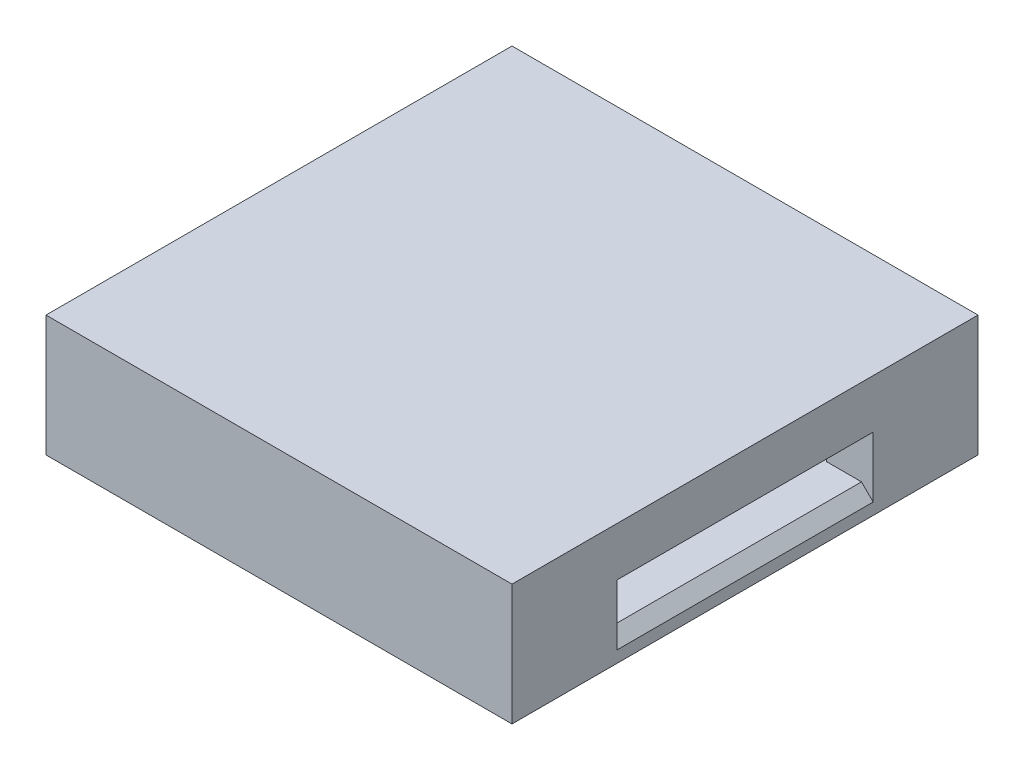
ISO-10303-21;
HEADER;
FILE_DESCRIPTION(('STEP AP214'),'2;1');
FILE_NAME('part.step','',(''),(''),'','','');
FILE_SCHEMA(('AUTOMOTIVE_DESIGN { 1 0 10303 214 1 1 1 1 }'));
ENDSEC;
DATA;
#1=APPLICATION_CONTEXT('core data for automotive mechanical design processes');
#2=APPLICATION_PROTOCOL_DEFINITION('international standard','automotive_design',2000,#1);
#3=PRODUCT_CONTEXT('',#1,'mechanical');
#4=PRODUCT('Part','Part','',(#3));
#5=PRODUCT_RELATED_PRODUCT_CATEGORY('part','',(#4));
#6=PRODUCT_DEFINITION_FORMATION('','',#4);
#7=PRODUCT_DEFINITION_CONTEXT('part definition',#1,'design');
#8=PRODUCT_DEFINITION('design','',#6,#7);
#9=PRODUCT_DEFINITION_SHAPE('','',#8);
#10=(LENGTH_UNIT() NAMED_UNIT(*) SI_UNIT(.MILLI.,.METRE.));
#11=(NAMED_UNIT(*) PLANE_ANGLE_UNIT() SI_UNIT($,.RADIAN.));
#12=(NAMED_UNIT(*) SI_UNIT($,.STERADIAN.) SOLID_ANGLE_UNIT());
#13=UNCERTAINTY_MEASURE_WITH_UNIT(LENGTH_MEASURE(1.E-05),#10,'distance_accuracy_value','');
#14=(GEOMETRIC_REPRESENTATION_CONTEXT(3) GLOBAL_UNCERTAINTY_ASSIGNED_CONTEXT((#13)) GLOBAL_UNIT_ASSIGNED_CONTEXT((#10,
#11,#12)) REPRESENTATION_CONTEXT('',''));
#15=CARTESIAN_POINT('',(0.,0.,0.));
#16=DIRECTION('',(0.,0.,1.));
#17=DIRECTION('',(1.,0.,0.));
#18=AXIS2_PLACEMENT_3D('',#15,#16,#17);
#19=CARTESIAN_POINT('',(0.,1.,0.));
#20=DIRECTION('',(0.,-1.,0.));
#21=DIRECTION('',(0.,0.,-1.));
#22=AXIS2_PLACEMENT_3D('',#19,#20,#21);
#23=PLANE('',#22);
#24=DIRECTION('',(-1.,0.,0.));
#25=VECTOR('',#24,1.);
#26=CARTESIAN_POINT('',(0.,1.,-4.5));
#27=LINE('',#26,#25);
#28=CARTESIAN_POINT('',(19.5,1.,-4.5));
#29=VERTEX_POINT('',#28);
#30=CARTESIAN_POINT('',(18.,1.,-4.5));
#31=VERTEX_POINT('',#30);
#32=EDGE_CURVE('E199',#29,#31,#27,.T.);
#33=ORIENTED_EDGE('',*,*,#32,.F.);
#34=DIRECTION('',(0.,0.,-1.));
#35=VECTOR('',#34,1.);
#36=CARTESIAN_POINT('',(19.5,1.,0.));
#37=LINE('',#36,#35);
#38=CARTESIAN_POINT('',(19.5,1.,-15.5));
#39=VERTEX_POINT('',#38);
#40=EDGE_CURVE('E150',#29,#39,#37,.T.);
#41=ORIENTED_EDGE('',*,*,#40,.T.);
#42=DIRECTION('',(-1.,0.,0.));
#43=VECTOR('',#42,1.);
#44=CARTESIAN_POINT('',(0.,1.,-15.5));
#45=LINE('',#44,#43);
#46=CARTESIAN_POINT('',(18.,1.,-15.5));
#47=VERTEX_POINT('',#46);
#48=EDGE_CURVE('E196',#39,#47,#45,.T.);
#49=ORIENTED_EDGE('',*,*,#48,.T.);
#50=DIRECTION('',(0.,0.,1.));
#51=VECTOR('',#50,1.);
#52=CARTESIAN_POINT('',(18.,1.,0.));
#53=LINE('',#52,#51);
#54=CARTESIAN_POINT('',(18.,1.,-18.05));
#55=VERTEX_POINT('',#54);
#56=EDGE_CURVE('E193',#55,#47,#53,.T.);
#57=ORIENTED_EDGE('',*,*,#56,.F.);
#58=DIRECTION('',(1.,0.,0.));
#59=VECTOR('',#58,1.);
#60=CARTESIAN_POINT('',(0.,1.,-18.05));
#61=LINE('',#60,#59);
#62=CARTESIAN_POINT('',(1.99999999999999,1.,-18.05));
#63=VERTEX_POINT('',#62);
#64=EDGE_CURVE('E171',#63,#55,#61,.T.);
#65=ORIENTED_EDGE('',*,*,#64,.F.);
#66=DIRECTION('',(0.,0.,1.));
#67=VECTOR('',#66,1.);
#68=CARTESIAN_POINT('',(2.,1.,0.));
#69=LINE('',#68,#67);
#70=CARTESIAN_POINT('',(2.,1.,-1.95));
#71=VERTEX_POINT('',#70);
#72=EDGE_CURVE('E176',#63,#71,#69,.T.);
#73=ORIENTED_EDGE('',*,*,#72,.T.);
#74=DIRECTION('',(1.,0.,0.));
#75=VECTOR('',#74,1.);
#76=CARTESIAN_POINT('',(0.,1.,-1.95));
#77=LINE('',#76,#75);
#78=CARTESIAN_POINT('',(18.,1.,-1.95));
#79=VERTEX_POINT('',#78);
#80=EDGE_CURVE('E201',#71,#79,#77,.T.);
#81=ORIENTED_EDGE('',*,*,#80,.T.);
#82=EDGE_CURVE('E197',#31,#79,#53,.T.);
#83=ORIENTED_EDGE('',*,*,#82,.F.);
#84=EDGE_LOOP('',(#33,#41,#49,#57,#65,#73,#81,#83));
#85=FACE_BOUND('',#84,.T.);
#86=ADVANCED_FACE('F43',(#85),#23,.F.);
#87=CARTESIAN_POINT('',(0.,1.,0.));
#88=DIRECTION('',(1.,0.,0.));
#89=DIRECTION('',(0.,0.,-1.));
#90=AXIS2_PLACEMENT_3D('',#87,#88,#89);
#91=PLANE('',#90);
#92=DIRECTION('',(0.,0.,1.));
#93=VECTOR('',#92,1.);
#94=CARTESIAN_POINT('',(0.,0.,0.));
#95=LINE('',#94,#93);
#96=CARTESIAN_POINT('',(0.,0.,-20.));
#97=VERTEX_POINT('',#96);
#98=CARTESIAN_POINT('',(0.,0.,0.));
#99=VERTEX_POINT('',#98);
#100=EDGE_CURVE('E148',#97,#99,#95,.T.);
#101=ORIENTED_EDGE('',*,*,#100,.T.);
#102=DIRECTION('',(0.,-1.,0.));
#103=VECTOR('',#102,1.);
#104=CARTESIAN_POINT('',(0.,1.,0.));
#105=LINE('',#104,#103);
#106=CARTESIAN_POINT('',(0.,5.2,0.));
#107=VERTEX_POINT('',#106);
#108=EDGE_CURVE('E141',#107,#99,#105,.T.);
#109=ORIENTED_EDGE('',*,*,#108,.F.);
#110=DIRECTION('',(0.,0.,1.));
#111=VECTOR('',#110,1.);
#112=CARTESIAN_POINT('',(0.,5.2,-20.));
#113=LINE('',#112,#111);
#114=CARTESIAN_POINT('',(0.,5.2,-20.));
#115=VERTEX_POINT('',#114);
#116=EDGE_CURVE('E146',#115,#107,#113,.T.);
#117=ORIENTED_EDGE('',*,*,#116,.F.);
#118=DIRECTION('',(0.,-1.,0.));
#119=VECTOR('',#118,1.);
#120=CARTESIAN_POINT('',(0.,1.,-20.));
#121=LINE('',#120,#119);
#122=EDGE_CURVE('E230',#115,#97,#121,.T.);
#123=ORIENTED_EDGE('',*,*,#122,.T.);
#124=EDGE_LOOP('',(#101,#109,#117,#123));
#125=FACE_BOUND('',#124,.T.);
#126=ADVANCED_FACE('F143',(#125),#91,.F.);
#127=CARTESIAN_POINT('',(0.,1.,0.));
#128=DIRECTION('',(0.,0.,-1.));
#129=DIRECTION('',(-1.,0.,0.));
#130=AXIS2_PLACEMENT_3D('',#127,#128,#129);
#131=PLANE('',#130);
#132=DIRECTION('',(1.,0.,0.));
#133=VECTOR('',#132,1.);
#134=CARTESIAN_POINT('',(0.,0.,0.));
#135=LINE('',#134,#133);
#136=CARTESIAN_POINT('',(20.,0.,0.));
#137=VERTEX_POINT('',#136);
#138=EDGE_CURVE('E224',#99,#137,#135,.T.);
#139=ORIENTED_EDGE('',*,*,#138,.T.);
#140=DIRECTION('',(0.,-1.,0.));
#141=VECTOR('',#140,1.);
#142=CARTESIAN_POINT('',(20.,1.,0.));
#143=LINE('',#142,#141);
#144=CARTESIAN_POINT('',(20.,5.2,0.));
#145=VERTEX_POINT('',#144);
#146=EDGE_CURVE('E151',#145,#137,#143,.T.);
#147=ORIENTED_EDGE('',*,*,#146,.F.);
#148=DIRECTION('',(1.,0.,0.));
#149=VECTOR('',#148,1.);
#150=CARTESIAN_POINT('',(0.,5.2,0.));
#151=LINE('',#150,#149);
#152=EDGE_CURVE('E154',#107,#145,#151,.T.);
#153=ORIENTED_EDGE('',*,*,#152,.F.);
#154=ORIENTED_EDGE('',*,*,#108,.T.);
#155=EDGE_LOOP('',(#139,#147,#153,#154));
#156=FACE_BOUND('',#155,.T.);
#157=ADVANCED_FACE('F155',(#156),#131,.F.);
#158=CARTESIAN_POINT('',(20.,1.,0.));
#159=DIRECTION('',(-1.,0.,0.));
#160=DIRECTION('',(0.,0.,1.));
#161=AXIS2_PLACEMENT_3D('',#158,#159,#160);
#162=PLANE('',#161);
#163=DIRECTION('',(0.,-1.,0.));
#164=VECTOR('',#163,1.);
#165=CARTESIAN_POINT('',(20.,1.,-20.));
#166=LINE('',#165,#164);
#167=CARTESIAN_POINT('',(20.,5.2,-20.));
#168=VERTEX_POINT('',#167);
#169=CARTESIAN_POINT('',(20.,0.,-20.));
#170=VERTEX_POINT('',#169);
#171=EDGE_CURVE('E232',#168,#170,#166,.T.);
#172=ORIENTED_EDGE('',*,*,#171,.F.);
#173=DIRECTION('',(0.,0.,-1.));
#174=VECTOR('',#173,1.);
#175=CARTESIAN_POINT('',(20.,5.2,-20.));
#176=LINE('',#175,#174);
#177=EDGE_CURVE('E160',#145,#168,#176,.T.);
#178=ORIENTED_EDGE('',*,*,#177,.F.);
#179=ORIENTED_EDGE('',*,*,#146,.T.);
#180=DIRECTION('',(0.,0.,-1.));
#181=VECTOR('',#180,1.);
#182=CARTESIAN_POINT('',(20.,0.,0.));
#183=LINE('',#182,#181);
#184=EDGE_CURVE('E226',#137,#170,#183,.T.);
#185=ORIENTED_EDGE('',*,*,#184,.T.);
#186=EDGE_LOOP('',(#172,#178,#179,#185));
#187=FACE_BOUND('',#186,.T.);
#188=DIRECTION('',(0.,-1.,0.));
#189=VECTOR('',#188,1.);
#190=CARTESIAN_POINT('',(20.,3.1,-15.5));
#191=LINE('',#190,#189);
#192=CARTESIAN_POINT('',(20.,3.1,-15.5));
#193=VERTEX_POINT('',#192);
#194=CARTESIAN_POINT('',(20.,0.499999999999996,-15.5));
#195=VERTEX_POINT('',#194);
#196=EDGE_CURVE('E59',#193,#195,#191,.T.);
#197=ORIENTED_EDGE('',*,*,#196,.T.);
#198=DIRECTION('',(0.,0.,1.));
#199=VECTOR('',#198,1.);
#200=CARTESIAN_POINT('',(20.,0.499999999999996,0.));
#201=LINE('',#200,#199);
#202=CARTESIAN_POINT('',(20.,0.499999999999996,-4.5));
#203=VERTEX_POINT('',#202);
#204=EDGE_CURVE('E238',#195,#203,#201,.T.);
#205=ORIENTED_EDGE('',*,*,#204,.T.);
#206=DIRECTION('',(0.,-1.,0.));
#207=VECTOR('',#206,1.);
#208=CARTESIAN_POINT('',(20.,3.1,-4.5));
#209=LINE('',#208,#207);
#210=CARTESIAN_POINT('',(20.,3.1,-4.5));
#211=VERTEX_POINT('',#210);
#212=EDGE_CURVE('E66',#211,#203,#209,.T.);
#213=ORIENTED_EDGE('',*,*,#212,.F.);
#214=DIRECTION('',(0.,0.,-1.));
#215=VECTOR('',#214,1.);
#216=CARTESIAN_POINT('',(20.,3.1,-20.));
#217=LINE('',#216,#215);
#218=EDGE_CURVE('E166',#211,#193,#217,.T.);
#219=ORIENTED_EDGE('',*,*,#218,.T.);
#220=EDGE_LOOP('',(#197,#205,#213,#219));
#221=FACE_BOUND('',#220,.T.);
#222=ADVANCED_FACE('F246',(#187,#221),#162,.F.);
#223=CARTESIAN_POINT('',(0.,1.,-20.));
#224=DIRECTION('',(0.,0.,1.));
#225=DIRECTION('',(1.,0.,0.));
#226=AXIS2_PLACEMENT_3D('',#223,#224,#225);
#227=PLANE('',#226);
#228=DIRECTION('',(-1.,0.,0.));
#229=VECTOR('',#228,1.);
#230=CARTESIAN_POINT('',(0.,0.,-20.));
#231=LINE('',#230,#229);
#232=EDGE_CURVE('E228',#170,#97,#231,.T.);
#233=ORIENTED_EDGE('',*,*,#232,.T.);
#234=ORIENTED_EDGE('',*,*,#122,.F.);
#235=DIRECTION('',(-1.,0.,0.));
#236=VECTOR('',#235,1.);
#237=CARTESIAN_POINT('',(0.,5.2,-20.));
#238=LINE('',#237,#236);
#239=EDGE_CURVE('E165',#168,#115,#238,.T.);
#240=ORIENTED_EDGE('',*,*,#239,.F.);
#241=ORIENTED_EDGE('',*,*,#171,.T.);
#242=EDGE_LOOP('',(#233,#234,#240,#241));
#243=FACE_BOUND('',#242,.T.);
#244=ADVANCED_FACE('F284',(#243),#227,.F.);
#245=CARTESIAN_POINT('',(0.,0.,0.));
#246=DIRECTION('',(0.,-1.,0.));
#247=DIRECTION('',(0.,0.,-1.));
#248=AXIS2_PLACEMENT_3D('',#245,#246,#247);
#249=PLANE('',#248);
#250=ORIENTED_EDGE('',*,*,#100,.F.);
#251=ORIENTED_EDGE('',*,*,#232,.F.);
#252=ORIENTED_EDGE('',*,*,#184,.F.);
#253=ORIENTED_EDGE('',*,*,#138,.F.);
#254=EDGE_LOOP('',(#250,#251,#252,#253));
#255=FACE_BOUND('',#254,.T.);
#256=ADVANCED_FACE('F276',(#255),#249,.T.);
#257=CARTESIAN_POINT('',(0.,3.1,-18.05));
#258=DIRECTION('',(0.,0.,-1.));
#259=DIRECTION('',(-1.,0.,0.));
#260=AXIS2_PLACEMENT_3D('',#257,#258,#259);
#261=PLANE('',#260);
#262=ORIENTED_EDGE('',*,*,#64,.T.);
#263=DIRECTION('',(0.,-1.,0.));
#264=VECTOR('',#263,1.);
#265=CARTESIAN_POINT('',(18.,3.1,-18.05));
#266=LINE('',#265,#264);
#267=CARTESIAN_POINT('',(18.,3.1,-18.05));
#268=VERTEX_POINT('',#267);
#269=EDGE_CURVE('E220',#268,#55,#266,.T.);
#270=ORIENTED_EDGE('',*,*,#269,.F.);
#271=DIRECTION('',(1.,0.,0.));
#272=VECTOR('',#271,1.);
#273=CARTESIAN_POINT('',(0.,3.1,-18.05));
#274=LINE('',#273,#272);
#275=CARTESIAN_POINT('',(1.99999999999999,3.1,-18.05));
#276=VERTEX_POINT('',#275);
#277=EDGE_CURVE('E173',#276,#268,#274,.T.);
#278=ORIENTED_EDGE('',*,*,#277,.F.);
#279=DIRECTION('',(0.,-1.,0.));
#280=VECTOR('',#279,1.);
#281=CARTESIAN_POINT('',(1.99999999999999,3.1,-18.05));
#282=LINE('',#281,#280);
#283=EDGE_CURVE('E190',#276,#63,#282,.T.);
#284=ORIENTED_EDGE('',*,*,#283,.T.);
#285=EDGE_LOOP('',(#262,#270,#278,#284));
#286=FACE_BOUND('',#285,.T.);
#287=ADVANCED_FACE('F274',(#286),#261,.F.);
#288=CARTESIAN_POINT('',(18.,3.1,0.));
#289=DIRECTION('',(1.,0.,0.));
#290=DIRECTION('',(0.,0.,-1.));
#291=AXIS2_PLACEMENT_3D('',#288,#289,#290);
#292=PLANE('',#291);
#293=ORIENTED_EDGE('',*,*,#56,.T.);
#294=DIRECTION('',(0.,-1.,0.));
#295=VECTOR('',#294,1.);
#296=CARTESIAN_POINT('',(18.,3.1,-15.5));
#297=LINE('',#296,#295);
#298=CARTESIAN_POINT('',(18.,3.1,-15.5));
#299=VERTEX_POINT('',#298);
#300=EDGE_CURVE('E217',#299,#47,#297,.T.);
#301=ORIENTED_EDGE('',*,*,#300,.F.);
#302=DIRECTION('',(0.,0.,1.));
#303=VECTOR('',#302,1.);
#304=CARTESIAN_POINT('',(18.,3.1,0.));
#305=LINE('',#304,#303);
#306=EDGE_CURVE('E175',#268,#299,#305,.T.);
#307=ORIENTED_EDGE('',*,*,#306,.F.);
#308=ORIENTED_EDGE('',*,*,#269,.T.);
#309=EDGE_LOOP('',(#293,#301,#307,#308));
#310=FACE_BOUND('',#309,.T.);
#311=ADVANCED_FACE('F256',(#310),#292,.F.);
#312=CARTESIAN_POINT('',(0.,3.1,-15.5));
#313=DIRECTION('',(0.,0.,1.));
#314=DIRECTION('',(1.,0.,0.));
#315=AXIS2_PLACEMENT_3D('',#312,#313,#314);
#316=PLANE('',#315);
#317=ORIENTED_EDGE('',*,*,#48,.F.);
#318=DIRECTION('',(-0.707106781186545,0.70710678118655,0.));
#319=VECTOR('',#318,1.);
#320=CARTESIAN_POINT('',(19.5,1.,-15.5));
#321=LINE('',#320,#319);
#322=EDGE_CURVE('E52',#39,#195,#321,.F.);
#323=ORIENTED_EDGE('',*,*,#322,.T.);
#324=ORIENTED_EDGE('',*,*,#196,.F.);
#325=DIRECTION('',(-1.,0.,0.));
#326=VECTOR('',#325,1.);
#327=CARTESIAN_POINT('',(0.,3.1,-15.5));
#328=LINE('',#327,#326);
#329=EDGE_CURVE('E178',#193,#299,#328,.T.);
#330=ORIENTED_EDGE('',*,*,#329,.T.);
#331=ORIENTED_EDGE('',*,*,#300,.T.);
#332=EDGE_LOOP('',(#317,#323,#324,#330,#331));
#333=FACE_BOUND('',#332,.T.);
#334=ADVANCED_FACE('F242',(#333),#316,.T.);
#335=CARTESIAN_POINT('',(0.,3.1,-4.5));
#336=DIRECTION('',(0.,0.,1.));
#337=DIRECTION('',(1.,0.,0.));
#338=AXIS2_PLACEMENT_3D('',#335,#336,#337);
#339=PLANE('',#338);
#340=ORIENTED_EDGE('',*,*,#212,.T.);
#341=DIRECTION('',(0.707106781186545,-0.70710678118655,0.));
#342=VECTOR('',#341,1.);
#343=CARTESIAN_POINT('',(8.70000000000007,11.8,-4.5));
#344=LINE('',#343,#342);
#345=EDGE_CURVE('E11',#203,#29,#344,.F.);
#346=ORIENTED_EDGE('',*,*,#345,.T.);
#347=ORIENTED_EDGE('',*,*,#32,.T.);
#348=DIRECTION('',(0.,-1.,0.));
#349=VECTOR('',#348,1.);
#350=CARTESIAN_POINT('',(18.,3.1,-4.5));
#351=LINE('',#350,#349);
#352=CARTESIAN_POINT('',(18.,3.1,-4.5));
#353=VERTEX_POINT('',#352);
#354=EDGE_CURVE('E212',#353,#31,#351,.T.);
#355=ORIENTED_EDGE('',*,*,#354,.F.);
#356=DIRECTION('',(-1.,0.,0.));
#357=VECTOR('',#356,1.);
#358=CARTESIAN_POINT('',(0.,3.1,-4.5));
#359=LINE('',#358,#357);
#360=EDGE_CURVE('E182',#211,#353,#359,.T.);
#361=ORIENTED_EDGE('',*,*,#360,.F.);
#362=EDGE_LOOP('',(#340,#346,#347,#355,#361));
#363=FACE_BOUND('',#362,.T.);
#364=ADVANCED_FACE('F248',(#363),#339,.F.);
#365=ORIENTED_EDGE('',*,*,#82,.T.);
#366=DIRECTION('',(0.,-1.,0.));
#367=VECTOR('',#366,1.);
#368=CARTESIAN_POINT('',(18.,3.1,-1.95));
#369=LINE('',#368,#367);
#370=CARTESIAN_POINT('',(18.,3.1,-1.95));
#371=VERTEX_POINT('',#370);
#372=EDGE_CURVE('E209',#371,#79,#369,.T.);
#373=ORIENTED_EDGE('',*,*,#372,.F.);
#374=EDGE_CURVE('E179',#353,#371,#305,.T.);
#375=ORIENTED_EDGE('',*,*,#374,.F.);
#376=ORIENTED_EDGE('',*,*,#354,.T.);
#377=EDGE_LOOP('',(#365,#373,#375,#376));
#378=FACE_BOUND('',#377,.T.);
#379=ADVANCED_FACE('F264',(#378),#292,.F.);
#380=CARTESIAN_POINT('',(0.,3.1,-1.95));
#381=DIRECTION('',(0.,0.,-1.));
#382=DIRECTION('',(-1.,0.,0.));
#383=AXIS2_PLACEMENT_3D('',#380,#381,#382);
#384=PLANE('',#383);
#385=ORIENTED_EDGE('',*,*,#80,.F.);
#386=DIRECTION('',(0.,-1.,0.));
#387=VECTOR('',#386,1.);
#388=CARTESIAN_POINT('',(2.,3.1,-1.95));
#389=LINE('',#388,#387);
#390=CARTESIAN_POINT('',(2.,3.1,-1.95));
#391=VERTEX_POINT('',#390);
#392=EDGE_CURVE('E206',#391,#71,#389,.T.);
#393=ORIENTED_EDGE('',*,*,#392,.F.);
#394=DIRECTION('',(1.,0.,0.));
#395=VECTOR('',#394,1.);
#396=CARTESIAN_POINT('',(0.,3.1,-1.95));
#397=LINE('',#396,#395);
#398=EDGE_CURVE('E184',#391,#371,#397,.T.);
#399=ORIENTED_EDGE('',*,*,#398,.T.);
#400=ORIENTED_EDGE('',*,*,#372,.T.);
#401=EDGE_LOOP('',(#385,#393,#399,#400));
#402=FACE_BOUND('',#401,.T.);
#403=ADVANCED_FACE('F267',(#402),#384,.T.);
#404=CARTESIAN_POINT('',(2.,3.1,0.));
#405=DIRECTION('',(1.,0.,0.));
#406=DIRECTION('',(0.,0.,-1.));
#407=AXIS2_PLACEMENT_3D('',#404,#405,#406);
#408=PLANE('',#407);
#409=ORIENTED_EDGE('',*,*,#72,.F.);
#410=ORIENTED_EDGE('',*,*,#283,.F.);
#411=DIRECTION('',(0.,0.,1.));
#412=VECTOR('',#411,1.);
#413=CARTESIAN_POINT('',(2.,3.1,0.));
#414=LINE('',#413,#412);
#415=EDGE_CURVE('E187',#276,#391,#414,.T.);
#416=ORIENTED_EDGE('',*,*,#415,.T.);
#417=ORIENTED_EDGE('',*,*,#392,.T.);
#418=EDGE_LOOP('',(#409,#410,#416,#417));
#419=FACE_BOUND('',#418,.T.);
#420=ADVANCED_FACE('F272',(#419),#408,.T.);
#421=CARTESIAN_POINT('',(19.5,1.,0.));
#422=DIRECTION('',(-0.70710678118655,-0.707106781186545,0.));
#423=DIRECTION('',(0.,0.,-1.));
#424=AXIS2_PLACEMENT_3D('',#421,#422,#423);
#425=PLANE('',#424);
#426=ORIENTED_EDGE('',*,*,#345,.F.);
#427=ORIENTED_EDGE('',*,*,#204,.F.);
#428=ORIENTED_EDGE('',*,*,#322,.F.);
#429=ORIENTED_EDGE('',*,*,#40,.F.);
#430=EDGE_LOOP('',(#426,#427,#428,#429));
#431=FACE_BOUND('',#430,.T.);
#432=ADVANCED_FACE('F46',(#431),#425,.F.);
#433=CARTESIAN_POINT('',(0.,5.2,0.));
#434=DIRECTION('',(0.,1.,0.));
#435=DIRECTION('',(0.,0.,1.));
#436=AXIS2_PLACEMENT_3D('',#433,#434,#435);
#437=PLANE('',#436);
#438=ORIENTED_EDGE('',*,*,#116,.T.);
#439=ORIENTED_EDGE('',*,*,#152,.T.);
#440=ORIENTED_EDGE('',*,*,#177,.T.);
#441=ORIENTED_EDGE('',*,*,#239,.T.);
#442=EDGE_LOOP('',(#438,#439,#440,#441));
#443=FACE_BOUND('',#442,.T.);
#444=ADVANCED_FACE('F163',(#443),#437,.T.);
#445=CARTESIAN_POINT('',(0.,3.1,0.));
#446=DIRECTION('',(0.,1.,0.));
#447=DIRECTION('',(0.,0.,1.));
#448=AXIS2_PLACEMENT_3D('',#445,#446,#447);
#449=PLANE('',#448);
#450=ORIENTED_EDGE('',*,*,#329,.F.);
#451=ORIENTED_EDGE('',*,*,#218,.F.);
#452=ORIENTED_EDGE('',*,*,#360,.T.);
#453=ORIENTED_EDGE('',*,*,#374,.T.);
#454=ORIENTED_EDGE('',*,*,#398,.F.);
#455=ORIENTED_EDGE('',*,*,#415,.F.);
#456=ORIENTED_EDGE('',*,*,#277,.T.);
#457=ORIENTED_EDGE('',*,*,#306,.T.);
#458=EDGE_LOOP('',(#450,#451,#452,#453,#454,#455,#456,#457));
#459=FACE_BOUND('',#458,.T.);
#460=ADVANCED_FACE('F251',(#459),#449,.F.);
#461=CLOSED_SHELL('',(#86,#126,#157,#222,#244,#256,#287,#311,#334,#364,#379,#403,#420,#432,#444,#460));
#462=MANIFOLD_SOLID_BREP('B2',#461);
#463=ADVANCED_BREP_SHAPE_REPRESENTATION('',(#18,#462),#14);
#464=SHAPE_DEFINITION_REPRESENTATION(#9,#463);
ENDSEC;
END-ISO-10303-21;
